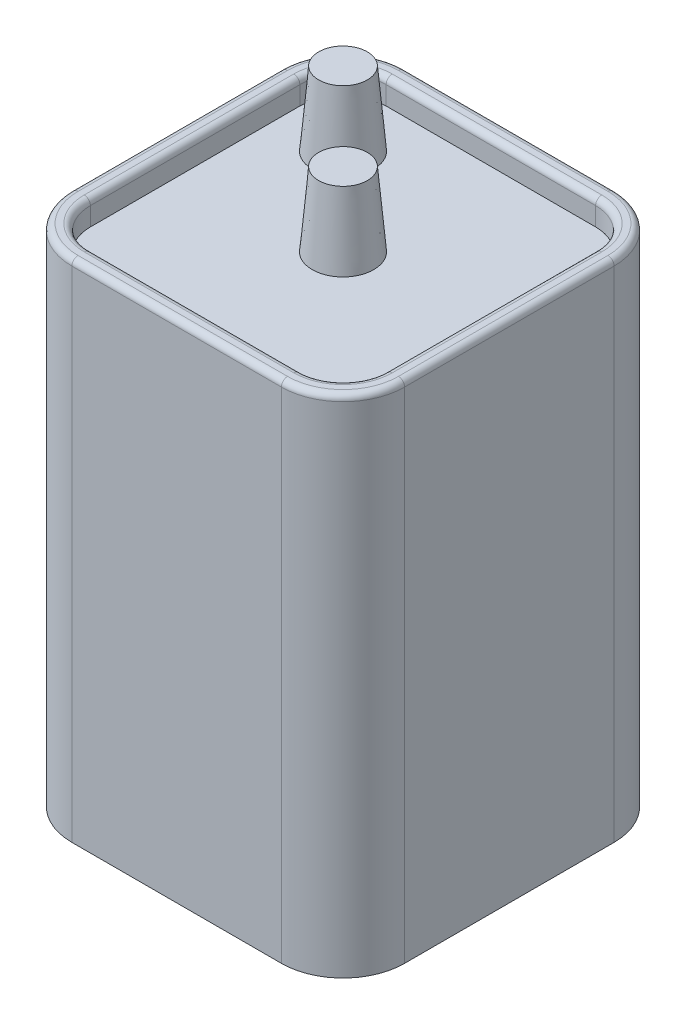
ISO-10303-21;
HEADER;
FILE_DESCRIPTION(('STEP AP214'),'2;1');
FILE_NAME('part.step','',(''),(''),'','','');
FILE_SCHEMA(('AUTOMOTIVE_DESIGN { 1 0 10303 214 1 1 1 1 }'));
ENDSEC;
DATA;
#1=APPLICATION_CONTEXT('core data for automotive mechanical design processes');
#2=APPLICATION_PROTOCOL_DEFINITION('international standard','automotive_design',2000,#1);
#3=PRODUCT_CONTEXT('',#1,'mechanical');
#4=PRODUCT('Part','Part','',(#3));
#5=PRODUCT_RELATED_PRODUCT_CATEGORY('part','',(#4));
#6=PRODUCT_DEFINITION_FORMATION('','',#4);
#7=PRODUCT_DEFINITION_CONTEXT('part definition',#1,'design');
#8=PRODUCT_DEFINITION('design','',#6,#7);
#9=PRODUCT_DEFINITION_SHAPE('','',#8);
#10=(LENGTH_UNIT() NAMED_UNIT(*) SI_UNIT(.MILLI.,.METRE.));
#11=(NAMED_UNIT(*) PLANE_ANGLE_UNIT() SI_UNIT($,.RADIAN.));
#12=(NAMED_UNIT(*) SI_UNIT($,.STERADIAN.) SOLID_ANGLE_UNIT());
#13=UNCERTAINTY_MEASURE_WITH_UNIT(LENGTH_MEASURE(1.E-05),#10,'distance_accuracy_value','');
#14=(GEOMETRIC_REPRESENTATION_CONTEXT(3) GLOBAL_UNCERTAINTY_ASSIGNED_CONTEXT((#13)) GLOBAL_UNIT_ASSIGNED_CONTEXT((#10,
#11,#12)) REPRESENTATION_CONTEXT('',''));
#15=CARTESIAN_POINT('',(0.,0.,0.));
#16=DIRECTION('',(0.,0.,1.));
#17=DIRECTION('',(1.,0.,0.));
#18=AXIS2_PLACEMENT_3D('',#15,#16,#17);
#19=CARTESIAN_POINT('',(34.29,104.14,-34.29));
#20=DIRECTION('',(-1.,0.,0.));
#21=DIRECTION('',(0.,0.,1.));
#22=AXIS2_PLACEMENT_3D('',#19,#20,#21);
#23=PLANE('',#22);
#24=DIRECTION('',(0.,-1.,0.));
#25=VECTOR('',#24,1.);
#26=CARTESIAN_POINT('',(34.29,104.14,-21.59));
#27=LINE('',#26,#25);
#28=CARTESIAN_POINT('',(34.29,0.,-21.59));
#29=VERTEX_POINT('',#28);
#30=CARTESIAN_POINT('',(34.29,102.87,-21.59));
#31=VERTEX_POINT('',#30);
#32=EDGE_CURVE('E301',#29,#31,#27,.F.);
#33=ORIENTED_EDGE('',*,*,#32,.T.);
#34=DIRECTION('',(0.,0.,-1.));
#35=VECTOR('',#34,1.);
#36=CARTESIAN_POINT('',(34.29,102.87,21.59));
#37=LINE('',#36,#35);
#38=CARTESIAN_POINT('',(34.29,102.87,21.59));
#39=VERTEX_POINT('',#38);
#40=EDGE_CURVE('E346',#31,#39,#37,.F.);
#41=ORIENTED_EDGE('',*,*,#40,.T.);
#42=DIRECTION('',(0.,-1.,0.));
#43=VECTOR('',#42,1.);
#44=CARTESIAN_POINT('',(34.29,104.14,21.59));
#45=LINE('',#44,#43);
#46=CARTESIAN_POINT('',(34.29,0.,21.59));
#47=VERTEX_POINT('',#46);
#48=EDGE_CURVE('E299',#39,#47,#45,.T.);
#49=ORIENTED_EDGE('',*,*,#48,.T.);
#50=DIRECTION('',(0.,0.,-1.));
#51=VECTOR('',#50,1.);
#52=CARTESIAN_POINT('',(34.29,0.,-34.29));
#53=LINE('',#52,#51);
#54=EDGE_CURVE('E255',#47,#29,#53,.T.);
#55=ORIENTED_EDGE('',*,*,#54,.T.);
#56=EDGE_LOOP('',(#33,#41,#49,#55));
#57=FACE_BOUND('',#56,.T.);
#58=ADVANCED_FACE('F44',(#57),#23,.F.);
#59=CARTESIAN_POINT('',(-34.29,104.14,-34.29));
#60=DIRECTION('',(0.,0.,1.));
#61=DIRECTION('',(1.,0.,0.));
#62=AXIS2_PLACEMENT_3D('',#59,#60,#61);
#63=PLANE('',#62);
#64=DIRECTION('',(0.,-1.,0.));
#65=VECTOR('',#64,1.);
#66=CARTESIAN_POINT('',(-21.59,104.14,-34.29));
#67=LINE('',#66,#65);
#68=CARTESIAN_POINT('',(-21.59,0.,-34.29));
#69=VERTEX_POINT('',#68);
#70=CARTESIAN_POINT('',(-21.59,102.87,-34.29));
#71=VERTEX_POINT('',#70);
#72=EDGE_CURVE('E296',#69,#71,#67,.F.);
#73=ORIENTED_EDGE('',*,*,#72,.T.);
#74=DIRECTION('',(-1.,0.,0.));
#75=VECTOR('',#74,1.);
#76=CARTESIAN_POINT('',(21.59,102.87,-34.29));
#77=LINE('',#76,#75);
#78=CARTESIAN_POINT('',(21.59,102.87,-34.29));
#79=VERTEX_POINT('',#78);
#80=EDGE_CURVE('E358',#71,#79,#77,.F.);
#81=ORIENTED_EDGE('',*,*,#80,.T.);
#82=DIRECTION('',(0.,-1.,0.));
#83=VECTOR('',#82,1.);
#84=CARTESIAN_POINT('',(21.59,104.14,-34.29));
#85=LINE('',#84,#83);
#86=CARTESIAN_POINT('',(21.59,0.,-34.29));
#87=VERTEX_POINT('',#86);
#88=EDGE_CURVE('E294',#79,#87,#85,.T.);
#89=ORIENTED_EDGE('',*,*,#88,.T.);
#90=DIRECTION('',(-1.,0.,0.));
#91=VECTOR('',#90,1.);
#92=CARTESIAN_POINT('',(-34.29,0.,-34.29));
#93=LINE('',#92,#91);
#94=EDGE_CURVE('E272',#87,#69,#93,.T.);
#95=ORIENTED_EDGE('',*,*,#94,.T.);
#96=EDGE_LOOP('',(#73,#81,#89,#95));
#97=FACE_BOUND('',#96,.T.);
#98=ADVANCED_FACE('F460',(#97),#63,.F.);
#99=CARTESIAN_POINT('',(-34.29,104.14,-34.29));
#100=DIRECTION('',(1.,0.,0.));
#101=DIRECTION('',(0.,0.,-1.));
#102=AXIS2_PLACEMENT_3D('',#99,#100,#101);
#103=PLANE('',#102);
#104=DIRECTION('',(0.,-1.,0.));
#105=VECTOR('',#104,1.);
#106=CARTESIAN_POINT('',(-34.29,104.14,21.59));
#107=LINE('',#106,#105);
#108=CARTESIAN_POINT('',(-34.29,0.,21.59));
#109=VERTEX_POINT('',#108);
#110=CARTESIAN_POINT('',(-34.29,102.87,21.59));
#111=VERTEX_POINT('',#110);
#112=EDGE_CURVE('E281',#109,#111,#107,.F.);
#113=ORIENTED_EDGE('',*,*,#112,.T.);
#114=DIRECTION('',(0.,0.,1.));
#115=VECTOR('',#114,1.);
#116=CARTESIAN_POINT('',(-34.29,102.87,-21.59));
#117=LINE('',#116,#115);
#118=CARTESIAN_POINT('',(-34.29,102.87,-21.59));
#119=VERTEX_POINT('',#118);
#120=EDGE_CURVE('E354',#111,#119,#117,.F.);
#121=ORIENTED_EDGE('',*,*,#120,.T.);
#122=DIRECTION('',(0.,-1.,0.));
#123=VECTOR('',#122,1.);
#124=CARTESIAN_POINT('',(-34.29,104.14,-21.59));
#125=LINE('',#124,#123);
#126=CARTESIAN_POINT('',(-34.29,0.,-21.59));
#127=VERTEX_POINT('',#126);
#128=EDGE_CURVE('E284',#119,#127,#125,.T.);
#129=ORIENTED_EDGE('',*,*,#128,.T.);
#130=DIRECTION('',(0.,0.,1.));
#131=VECTOR('',#130,1.);
#132=CARTESIAN_POINT('',(-34.29,0.,-34.29));
#133=LINE('',#132,#131);
#134=EDGE_CURVE('E275',#127,#109,#133,.T.);
#135=ORIENTED_EDGE('',*,*,#134,.T.);
#136=EDGE_LOOP('',(#113,#121,#129,#135));
#137=FACE_BOUND('',#136,.T.);
#138=ADVANCED_FACE('F466',(#137),#103,.F.);
#139=CARTESIAN_POINT('',(-34.29,104.14,34.29));
#140=DIRECTION('',(0.,0.,-1.));
#141=DIRECTION('',(-1.,0.,0.));
#142=AXIS2_PLACEMENT_3D('',#139,#140,#141);
#143=PLANE('',#142);
#144=DIRECTION('',(0.,-1.,0.));
#145=VECTOR('',#144,1.);
#146=CARTESIAN_POINT('',(21.59,104.14,34.29));
#147=LINE('',#146,#145);
#148=CARTESIAN_POINT('',(21.59,0.,34.29));
#149=VERTEX_POINT('',#148);
#150=CARTESIAN_POINT('',(21.59,102.87,34.29));
#151=VERTEX_POINT('',#150);
#152=EDGE_CURVE('E306',#149,#151,#147,.F.);
#153=ORIENTED_EDGE('',*,*,#152,.T.);
#154=DIRECTION('',(1.,0.,0.));
#155=VECTOR('',#154,1.);
#156=CARTESIAN_POINT('',(-21.59,102.87,34.29));
#157=LINE('',#156,#155);
#158=CARTESIAN_POINT('',(-21.59,102.87,34.29));
#159=VERTEX_POINT('',#158);
#160=EDGE_CURVE('E350',#151,#159,#157,.F.);
#161=ORIENTED_EDGE('',*,*,#160,.T.);
#162=DIRECTION('',(0.,-1.,0.));
#163=VECTOR('',#162,1.);
#164=CARTESIAN_POINT('',(-21.59,104.14,34.29));
#165=LINE('',#164,#163);
#166=CARTESIAN_POINT('',(-21.59,0.,34.29));
#167=VERTEX_POINT('',#166);
#168=EDGE_CURVE('E304',#159,#167,#165,.T.);
#169=ORIENTED_EDGE('',*,*,#168,.T.);
#170=DIRECTION('',(1.,0.,0.));
#171=VECTOR('',#170,1.);
#172=CARTESIAN_POINT('',(-34.29,0.,34.29));
#173=LINE('',#172,#171);
#174=EDGE_CURVE('E278',#167,#149,#173,.T.);
#175=ORIENTED_EDGE('',*,*,#174,.T.);
#176=EDGE_LOOP('',(#153,#161,#169,#175));
#177=FACE_BOUND('',#176,.T.);
#178=ADVANCED_FACE('F665',(#177),#143,.F.);
#179=CARTESIAN_POINT('',(0.,104.14,0.));
#180=DIRECTION('',(0.,1.,0.));
#181=DIRECTION('',(0.,0.,1.));
#182=AXIS2_PLACEMENT_3D('',#179,#180,#181);
#183=PLANE('',#182);
#184=DIRECTION('',(0.,0.,-1.));
#185=VECTOR('',#184,1.);
#186=CARTESIAN_POINT('',(33.02,104.14,-21.59));
#187=LINE('',#186,#185);
#188=CARTESIAN_POINT('',(33.02,104.14,21.59));
#189=VERTEX_POINT('',#188);
#190=CARTESIAN_POINT('',(33.02,104.14,-21.59));
#191=VERTEX_POINT('',#190);
#192=EDGE_CURVE('E338',#189,#191,#187,.T.);
#193=ORIENTED_EDGE('',*,*,#192,.T.);
#194=CARTESIAN_POINT('',(21.59,104.14,-21.59));
#195=DIRECTION('',(0.,1.,0.));
#196=DIRECTION('',(0.,0.,1.));
#197=AXIS2_PLACEMENT_3D('',#194,#195,#196);
#198=CIRCLE('',#197,11.43);
#199=CARTESIAN_POINT('',(21.59,104.14,-33.02));
#200=VERTEX_POINT('',#199);
#201=EDGE_CURVE('E340',#191,#200,#198,.T.);
#202=ORIENTED_EDGE('',*,*,#201,.T.);
#203=DIRECTION('',(-1.,0.,0.));
#204=VECTOR('',#203,1.);
#205=CARTESIAN_POINT('',(-21.59,104.14,-33.02));
#206=LINE('',#205,#204);
#207=CARTESIAN_POINT('',(-21.59,104.14,-33.02));
#208=VERTEX_POINT('',#207);
#209=EDGE_CURVE('E326',#200,#208,#206,.T.);
#210=ORIENTED_EDGE('',*,*,#209,.T.);
#211=CARTESIAN_POINT('',(-21.59,104.14,-21.59));
#212=DIRECTION('',(0.,1.,0.));
#213=DIRECTION('',(0.,0.,1.));
#214=AXIS2_PLACEMENT_3D('',#211,#212,#213);
#215=CIRCLE('',#214,11.43);
#216=CARTESIAN_POINT('',(-33.02,104.14,-21.59));
#217=VERTEX_POINT('',#216);
#218=EDGE_CURVE('E328',#208,#217,#215,.T.);
#219=ORIENTED_EDGE('',*,*,#218,.T.);
#220=DIRECTION('',(0.,0.,1.));
#221=VECTOR('',#220,1.);
#222=CARTESIAN_POINT('',(-33.02,104.14,21.59));
#223=LINE('',#222,#221);
#224=CARTESIAN_POINT('',(-33.02,104.14,21.59));
#225=VERTEX_POINT('',#224);
#226=EDGE_CURVE('E330',#217,#225,#223,.T.);
#227=ORIENTED_EDGE('',*,*,#226,.T.);
#228=CARTESIAN_POINT('',(-21.59,104.14,21.59));
#229=DIRECTION('',(0.,1.,0.));
#230=DIRECTION('',(0.,0.,1.));
#231=AXIS2_PLACEMENT_3D('',#228,#229,#230);
#232=CIRCLE('',#231,11.43);
#233=CARTESIAN_POINT('',(-21.59,104.14,33.02));
#234=VERTEX_POINT('',#233);
#235=EDGE_CURVE('E332',#225,#234,#232,.T.);
#236=ORIENTED_EDGE('',*,*,#235,.T.);
#237=DIRECTION('',(1.,0.,0.));
#238=VECTOR('',#237,1.);
#239=CARTESIAN_POINT('',(21.59,104.14,33.02));
#240=LINE('',#239,#238);
#241=CARTESIAN_POINT('',(21.59,104.14,33.02));
#242=VERTEX_POINT('',#241);
#243=EDGE_CURVE('E334',#234,#242,#240,.T.);
#244=ORIENTED_EDGE('',*,*,#243,.T.);
#245=CARTESIAN_POINT('',(21.59,104.14,21.59));
#246=DIRECTION('',(0.,1.,0.));
#247=DIRECTION('',(0.,0.,1.));
#248=AXIS2_PLACEMENT_3D('',#245,#246,#247);
#249=CIRCLE('',#248,11.43);
#250=EDGE_CURVE('E336',#242,#189,#249,.T.);
#251=ORIENTED_EDGE('',*,*,#250,.T.);
#252=EDGE_LOOP('',(#193,#202,#210,#219,#227,#236,#244,#251));
#253=FACE_BOUND('',#252,.T.);
#254=CARTESIAN_POINT('',(-21.59,104.14,-21.59));
#255=DIRECTION('',(0.,1.,0.));
#256=DIRECTION('',(0.,0.,1.));
#257=AXIS2_PLACEMENT_3D('',#254,#255,#256);
#258=CIRCLE('',#257,10.16);
#259=CARTESIAN_POINT('',(-31.75,104.14,-21.59));
#260=VERTEX_POINT('',#259);
#261=CARTESIAN_POINT('',(-21.59,104.14,-31.75));
#262=VERTEX_POINT('',#261);
#263=EDGE_CURVE('E321',#260,#262,#258,.F.);
#264=ORIENTED_EDGE('',*,*,#263,.T.);
#265=DIRECTION('',(-1.,0.,0.));
#266=VECTOR('',#265,1.);
#267=CARTESIAN_POINT('',(21.59,104.14,-31.75));
#268=LINE('',#267,#266);
#269=CARTESIAN_POINT('',(21.59,104.14,-31.75));
#270=VERTEX_POINT('',#269);
#271=EDGE_CURVE('E323',#262,#270,#268,.F.);
#272=ORIENTED_EDGE('',*,*,#271,.T.);
#273=CARTESIAN_POINT('',(21.59,104.14,-21.59));
#274=DIRECTION('',(0.,1.,0.));
#275=DIRECTION('',(0.,0.,1.));
#276=AXIS2_PLACEMENT_3D('',#273,#274,#275);
#277=CIRCLE('',#276,10.16);
#278=CARTESIAN_POINT('',(31.75,104.14,-21.59));
#279=VERTEX_POINT('',#278);
#280=EDGE_CURVE('E309',#270,#279,#277,.F.);
#281=ORIENTED_EDGE('',*,*,#280,.T.);
#282=DIRECTION('',(0.,0.,-1.));
#283=VECTOR('',#282,1.);
#284=CARTESIAN_POINT('',(31.75,104.14,21.59));
#285=LINE('',#284,#283);
#286=CARTESIAN_POINT('',(31.75,104.14,21.59));
#287=VERTEX_POINT('',#286);
#288=EDGE_CURVE('E311',#279,#287,#285,.F.);
#289=ORIENTED_EDGE('',*,*,#288,.T.);
#290=CARTESIAN_POINT('',(21.59,104.14,21.59));
#291=DIRECTION('',(0.,1.,0.));
#292=DIRECTION('',(0.,0.,1.));
#293=AXIS2_PLACEMENT_3D('',#290,#291,#292);
#294=CIRCLE('',#293,10.16);
#295=CARTESIAN_POINT('',(21.59,104.14,31.75));
#296=VERTEX_POINT('',#295);
#297=EDGE_CURVE('E313',#287,#296,#294,.F.);
#298=ORIENTED_EDGE('',*,*,#297,.T.);
#299=DIRECTION('',(1.,0.,0.));
#300=VECTOR('',#299,1.);
#301=CARTESIAN_POINT('',(-21.59,104.14,31.75));
#302=LINE('',#301,#300);
#303=CARTESIAN_POINT('',(-21.59,104.14,31.75));
#304=VERTEX_POINT('',#303);
#305=EDGE_CURVE('E315',#296,#304,#302,.F.);
#306=ORIENTED_EDGE('',*,*,#305,.T.);
#307=CARTESIAN_POINT('',(-21.59,104.14,21.59));
#308=DIRECTION('',(0.,1.,0.));
#309=DIRECTION('',(0.,0.,1.));
#310=AXIS2_PLACEMENT_3D('',#307,#308,#309);
#311=CIRCLE('',#310,10.16);
#312=CARTESIAN_POINT('',(-31.75,104.14,21.59));
#313=VERTEX_POINT('',#312);
#314=EDGE_CURVE('E317',#304,#313,#311,.F.);
#315=ORIENTED_EDGE('',*,*,#314,.T.);
#316=DIRECTION('',(0.,0.,1.));
#317=VECTOR('',#316,1.);
#318=CARTESIAN_POINT('',(-31.75,104.14,-21.59));
#319=LINE('',#318,#317);
#320=EDGE_CURVE('E319',#313,#260,#319,.F.);
#321=ORIENTED_EDGE('',*,*,#320,.T.);
#322=EDGE_LOOP('',(#264,#272,#281,#289,#298,#306,#315,#321));
#323=FACE_BOUND('',#322,.T.);
#324=ADVANCED_FACE('F421',(#253,#323),#183,.T.);
#325=CARTESIAN_POINT('',(0.,0.,0.));
#326=DIRECTION('',(0.,1.,0.));
#327=DIRECTION('',(0.,0.,1.));
#328=AXIS2_PLACEMENT_3D('',#325,#326,#327);
#329=PLANE('',#328);
#330=ORIENTED_EDGE('',*,*,#134,.F.);
#331=CARTESIAN_POINT('',(-21.59,0.,-21.59));
#332=DIRECTION('',(0.,1.,0.));
#333=DIRECTION('',(0.,0.,1.));
#334=AXIS2_PLACEMENT_3D('',#331,#332,#333);
#335=CIRCLE('',#334,12.7);
#336=EDGE_CURVE('E292',#127,#69,#335,.F.);
#337=ORIENTED_EDGE('',*,*,#336,.T.);
#338=ORIENTED_EDGE('',*,*,#94,.F.);
#339=CARTESIAN_POINT('',(21.59,0.,-21.59));
#340=DIRECTION('',(0.,1.,0.));
#341=DIRECTION('',(0.,0.,1.));
#342=AXIS2_PLACEMENT_3D('',#339,#340,#341);
#343=CIRCLE('',#342,12.7);
#344=EDGE_CURVE('E290',#87,#29,#343,.F.);
#345=ORIENTED_EDGE('',*,*,#344,.T.);
#346=ORIENTED_EDGE('',*,*,#54,.F.);
#347=CARTESIAN_POINT('',(21.59,0.,21.59));
#348=DIRECTION('',(0.,1.,0.));
#349=DIRECTION('',(0.,0.,1.));
#350=AXIS2_PLACEMENT_3D('',#347,#348,#349);
#351=CIRCLE('',#350,12.7);
#352=EDGE_CURVE('E288',#47,#149,#351,.F.);
#353=ORIENTED_EDGE('',*,*,#352,.T.);
#354=ORIENTED_EDGE('',*,*,#174,.F.);
#355=CARTESIAN_POINT('',(-21.59,0.,21.59));
#356=DIRECTION('',(0.,1.,0.));
#357=DIRECTION('',(0.,0.,1.));
#358=AXIS2_PLACEMENT_3D('',#355,#356,#357);
#359=CIRCLE('',#358,12.7);
#360=EDGE_CURVE('E286',#167,#109,#359,.F.);
#361=ORIENTED_EDGE('',*,*,#360,.T.);
#362=EDGE_LOOP('',(#330,#337,#338,#345,#346,#353,#354,#361));
#363=FACE_BOUND('',#362,.T.);
#364=ADVANCED_FACE('F475',(#363),#329,.F.);
#365=CARTESIAN_POINT('',(-21.59,104.14,-21.59));
#366=DIRECTION('',(0.,-1.,0.));
#367=DIRECTION('',(0.,0.,-1.));
#368=AXIS2_PLACEMENT_3D('',#365,#366,#367);
#369=CYLINDRICAL_SURFACE('',#368,12.7);
#370=ORIENTED_EDGE('',*,*,#128,.F.);
#371=CARTESIAN_POINT('',(-21.59,102.87,-21.59));
#372=DIRECTION('',(0.,1.,0.));
#373=DIRECTION('',(0.,0.,1.));
#374=AXIS2_PLACEMENT_3D('',#371,#372,#373);
#375=CIRCLE('',#374,12.7);
#376=EDGE_CURVE('E356',#119,#71,#375,.F.);
#377=ORIENTED_EDGE('',*,*,#376,.T.);
#378=ORIENTED_EDGE('',*,*,#72,.F.);
#379=ORIENTED_EDGE('',*,*,#336,.F.);
#380=EDGE_LOOP('',(#370,#377,#378,#379));
#381=FACE_BOUND('',#380,.T.);
#382=ADVANCED_FACE('F471',(#381),#369,.T.);
#383=CARTESIAN_POINT('',(21.59,104.14,-21.59));
#384=DIRECTION('',(0.,-1.,0.));
#385=DIRECTION('',(0.,0.,-1.));
#386=AXIS2_PLACEMENT_3D('',#383,#384,#385);
#387=CYLINDRICAL_SURFACE('',#386,12.7);
#388=ORIENTED_EDGE('',*,*,#88,.F.);
#389=CARTESIAN_POINT('',(21.59,102.87,-21.59));
#390=DIRECTION('',(0.,1.,0.));
#391=DIRECTION('',(0.,0.,1.));
#392=AXIS2_PLACEMENT_3D('',#389,#390,#391);
#393=CIRCLE('',#392,12.7);
#394=EDGE_CURVE('E343',#79,#31,#393,.F.);
#395=ORIENTED_EDGE('',*,*,#394,.T.);
#396=ORIENTED_EDGE('',*,*,#32,.F.);
#397=ORIENTED_EDGE('',*,*,#344,.F.);
#398=EDGE_LOOP('',(#388,#395,#396,#397));
#399=FACE_BOUND('',#398,.T.);
#400=ADVANCED_FACE('F474',(#399),#387,.T.);
#401=CARTESIAN_POINT('',(21.59,104.14,21.59));
#402=DIRECTION('',(0.,-1.,0.));
#403=DIRECTION('',(0.,0.,-1.));
#404=AXIS2_PLACEMENT_3D('',#401,#402,#403);
#405=CYLINDRICAL_SURFACE('',#404,12.7);
#406=ORIENTED_EDGE('',*,*,#48,.F.);
#407=CARTESIAN_POINT('',(21.59,102.87,21.59));
#408=DIRECTION('',(0.,1.,0.));
#409=DIRECTION('',(0.,0.,1.));
#410=AXIS2_PLACEMENT_3D('',#407,#408,#409);
#411=CIRCLE('',#410,12.7);
#412=EDGE_CURVE('E348',#39,#151,#411,.F.);
#413=ORIENTED_EDGE('',*,*,#412,.T.);
#414=ORIENTED_EDGE('',*,*,#152,.F.);
#415=ORIENTED_EDGE('',*,*,#352,.F.);
#416=EDGE_LOOP('',(#406,#413,#414,#415));
#417=FACE_BOUND('',#416,.T.);
#418=ADVANCED_FACE('F479',(#417),#405,.T.);
#419=CARTESIAN_POINT('',(-21.59,104.14,21.59));
#420=DIRECTION('',(0.,-1.,0.));
#421=DIRECTION('',(0.,0.,-1.));
#422=AXIS2_PLACEMENT_3D('',#419,#420,#421);
#423=CYLINDRICAL_SURFACE('',#422,12.7);
#424=ORIENTED_EDGE('',*,*,#168,.F.);
#425=CARTESIAN_POINT('',(-21.59,102.87,21.59));
#426=DIRECTION('',(0.,1.,0.));
#427=DIRECTION('',(0.,0.,1.));
#428=AXIS2_PLACEMENT_3D('',#425,#426,#427);
#429=CIRCLE('',#428,12.7);
#430=EDGE_CURVE('E352',#159,#111,#429,.F.);
#431=ORIENTED_EDGE('',*,*,#430,.T.);
#432=ORIENTED_EDGE('',*,*,#112,.F.);
#433=ORIENTED_EDGE('',*,*,#360,.F.);
#434=EDGE_LOOP('',(#424,#431,#432,#433));
#435=FACE_BOUND('',#434,.T.);
#436=ADVANCED_FACE('F483',(#435),#423,.T.);
#437=CARTESIAN_POINT('',(21.59,99.06,-21.59));
#438=DIRECTION('',(0.,1.,0.));
#439=DIRECTION('',(0.,0.,1.));
#440=AXIS2_PLACEMENT_3D('',#437,#438,#439);
#441=CYLINDRICAL_SURFACE('',#440,8.89);
#442=DIRECTION('',(0.,1.,0.));
#443=VECTOR('',#442,1.);
#444=CARTESIAN_POINT('',(30.48,99.06,-21.59));
#445=LINE('',#444,#443);
#446=CARTESIAN_POINT('',(30.48,99.06,-21.59));
#447=VERTEX_POINT('',#446);
#448=CARTESIAN_POINT('',(30.48,102.87,-21.59));
#449=VERTEX_POINT('',#448);
#450=EDGE_CURVE('E253',#447,#449,#445,.T.);
#451=ORIENTED_EDGE('',*,*,#450,.T.);
#452=CARTESIAN_POINT('',(21.59,102.87,-21.59));
#453=DIRECTION('',(0.,1.,0.));
#454=DIRECTION('',(0.,0.,1.));
#455=AXIS2_PLACEMENT_3D('',#452,#453,#454);
#456=CIRCLE('',#455,8.89);
#457=CARTESIAN_POINT('',(21.59,102.87,-30.48));
#458=VERTEX_POINT('',#457);
#459=EDGE_CURVE('E13',#449,#458,#456,.T.);
#460=ORIENTED_EDGE('',*,*,#459,.T.);
#461=DIRECTION('',(0.,1.,0.));
#462=VECTOR('',#461,1.);
#463=CARTESIAN_POINT('',(21.59,99.06,-30.48));
#464=LINE('',#463,#462);
#465=CARTESIAN_POINT('',(21.59,99.06,-30.48));
#466=VERTEX_POINT('',#465);
#467=EDGE_CURVE('E206',#466,#458,#464,.T.);
#468=ORIENTED_EDGE('',*,*,#467,.F.);
#469=CARTESIAN_POINT('',(21.59,99.06,-21.59));
#470=DIRECTION('',(0.,1.,0.));
#471=DIRECTION('',(0.,0.,1.));
#472=AXIS2_PLACEMENT_3D('',#469,#470,#471);
#473=CIRCLE('',#472,8.89);
#474=EDGE_CURVE('E210',#447,#466,#473,.T.);
#475=ORIENTED_EDGE('',*,*,#474,.F.);
#476=EDGE_LOOP('',(#451,#460,#468,#475));
#477=FACE_BOUND('',#476,.T.);
#478=ADVANCED_FACE('F208',(#477),#441,.F.);
#479=CARTESIAN_POINT('',(30.48,99.06,21.59));
#480=DIRECTION('',(1.,0.,0.));
#481=DIRECTION('',(0.,0.,-1.));
#482=AXIS2_PLACEMENT_3D('',#479,#480,#481);
#483=PLANE('',#482);
#484=DIRECTION('',(0.,1.,0.));
#485=VECTOR('',#484,1.);
#486=CARTESIAN_POINT('',(30.48,99.06,21.59));
#487=LINE('',#486,#485);
#488=CARTESIAN_POINT('',(30.48,99.06,21.59));
#489=VERTEX_POINT('',#488);
#490=CARTESIAN_POINT('',(30.48,102.87,21.59));
#491=VERTEX_POINT('',#490);
#492=EDGE_CURVE('E256',#489,#491,#487,.T.);
#493=ORIENTED_EDGE('',*,*,#492,.T.);
#494=DIRECTION('',(0.,0.,-1.));
#495=VECTOR('',#494,1.);
#496=CARTESIAN_POINT('',(30.48,102.87,-21.59));
#497=LINE('',#496,#495);
#498=EDGE_CURVE('E53',#491,#449,#497,.T.);
#499=ORIENTED_EDGE('',*,*,#498,.T.);
#500=ORIENTED_EDGE('',*,*,#450,.F.);
#501=DIRECTION('',(0.,0.,-1.));
#502=VECTOR('',#501,1.);
#503=CARTESIAN_POINT('',(30.48,99.06,21.59));
#504=LINE('',#503,#502);
#505=EDGE_CURVE('E217',#489,#447,#504,.T.);
#506=ORIENTED_EDGE('',*,*,#505,.F.);
#507=EDGE_LOOP('',(#493,#499,#500,#506));
#508=FACE_BOUND('',#507,.T.);
#509=ADVANCED_FACE('F449',(#508),#483,.F.);
#510=CARTESIAN_POINT('',(21.59,99.06,21.59));
#511=DIRECTION('',(0.,1.,0.));
#512=DIRECTION('',(0.,0.,1.));
#513=AXIS2_PLACEMENT_3D('',#510,#511,#512);
#514=CYLINDRICAL_SURFACE('',#513,8.89);
#515=DIRECTION('',(0.,1.,0.));
#516=VECTOR('',#515,1.);
#517=CARTESIAN_POINT('',(21.59,99.06,30.48));
#518=LINE('',#517,#516);
#519=CARTESIAN_POINT('',(21.59,99.06,30.48));
#520=VERTEX_POINT('',#519);
#521=CARTESIAN_POINT('',(21.59,102.87,30.48));
#522=VERTEX_POINT('',#521);
#523=EDGE_CURVE('E258',#520,#522,#518,.T.);
#524=ORIENTED_EDGE('',*,*,#523,.T.);
#525=CARTESIAN_POINT('',(21.59,102.87,21.59));
#526=DIRECTION('',(0.,1.,0.));
#527=DIRECTION('',(0.,0.,1.));
#528=AXIS2_PLACEMENT_3D('',#525,#526,#527);
#529=CIRCLE('',#528,8.89);
#530=EDGE_CURVE('E68',#522,#491,#529,.T.);
#531=ORIENTED_EDGE('',*,*,#530,.T.);
#532=ORIENTED_EDGE('',*,*,#492,.F.);
#533=CARTESIAN_POINT('',(21.59,99.06,21.59));
#534=DIRECTION('',(0.,1.,0.));
#535=DIRECTION('',(0.,0.,1.));
#536=AXIS2_PLACEMENT_3D('',#533,#534,#535);
#537=CIRCLE('',#536,8.89);
#538=EDGE_CURVE('E250',#520,#489,#537,.T.);
#539=ORIENTED_EDGE('',*,*,#538,.F.);
#540=EDGE_LOOP('',(#524,#531,#532,#539));
#541=FACE_BOUND('',#540,.T.);
#542=ADVANCED_FACE('F450',(#541),#514,.F.);
#543=CARTESIAN_POINT('',(-21.59,99.06,30.48));
#544=DIRECTION('',(0.,0.,1.));
#545=DIRECTION('',(1.,0.,0.));
#546=AXIS2_PLACEMENT_3D('',#543,#544,#545);
#547=PLANE('',#546);
#548=DIRECTION('',(0.,1.,0.));
#549=VECTOR('',#548,1.);
#550=CARTESIAN_POINT('',(-21.59,99.06,30.48));
#551=LINE('',#550,#549);
#552=CARTESIAN_POINT('',(-21.59,99.06,30.48));
#553=VERTEX_POINT('',#552);
#554=CARTESIAN_POINT('',(-21.59,102.87,30.48));
#555=VERTEX_POINT('',#554);
#556=EDGE_CURVE('E260',#553,#555,#551,.T.);
#557=ORIENTED_EDGE('',*,*,#556,.T.);
#558=DIRECTION('',(1.,0.,0.));
#559=VECTOR('',#558,1.);
#560=CARTESIAN_POINT('',(21.59,102.87,30.48));
#561=LINE('',#560,#559);
#562=EDGE_CURVE('E368',#555,#522,#561,.T.);
#563=ORIENTED_EDGE('',*,*,#562,.T.);
#564=ORIENTED_EDGE('',*,*,#523,.F.);
#565=DIRECTION('',(1.,0.,0.));
#566=VECTOR('',#565,1.);
#567=CARTESIAN_POINT('',(-21.59,99.06,30.48));
#568=LINE('',#567,#566);
#569=EDGE_CURVE('E247',#553,#520,#568,.T.);
#570=ORIENTED_EDGE('',*,*,#569,.F.);
#571=EDGE_LOOP('',(#557,#563,#564,#570));
#572=FACE_BOUND('',#571,.T.);
#573=ADVANCED_FACE('F447',(#572),#547,.F.);
#574=CARTESIAN_POINT('',(-21.59,99.06,21.59));
#575=DIRECTION('',(0.,1.,0.));
#576=DIRECTION('',(0.,0.,1.));
#577=AXIS2_PLACEMENT_3D('',#574,#575,#576);
#578=CYLINDRICAL_SURFACE('',#577,8.89);
#579=DIRECTION('',(0.,1.,0.));
#580=VECTOR('',#579,1.);
#581=CARTESIAN_POINT('',(-30.48,99.06,21.59));
#582=LINE('',#581,#580);
#583=CARTESIAN_POINT('',(-30.48,99.06,21.59));
#584=VERTEX_POINT('',#583);
#585=CARTESIAN_POINT('',(-30.48,102.87,21.59));
#586=VERTEX_POINT('',#585);
#587=EDGE_CURVE('E263',#584,#586,#582,.T.);
#588=ORIENTED_EDGE('',*,*,#587,.T.);
#589=CARTESIAN_POINT('',(-21.59,102.87,21.59));
#590=DIRECTION('',(0.,1.,0.));
#591=DIRECTION('',(0.,0.,1.));
#592=AXIS2_PLACEMENT_3D('',#589,#590,#591);
#593=CIRCLE('',#592,8.89);
#594=EDGE_CURVE('E366',#586,#555,#593,.T.);
#595=ORIENTED_EDGE('',*,*,#594,.T.);
#596=ORIENTED_EDGE('',*,*,#556,.F.);
#597=CARTESIAN_POINT('',(-21.59,99.06,21.59));
#598=DIRECTION('',(0.,1.,0.));
#599=DIRECTION('',(0.,0.,1.));
#600=AXIS2_PLACEMENT_3D('',#597,#598,#599);
#601=CIRCLE('',#600,8.89);
#602=EDGE_CURVE('E244',#584,#553,#601,.T.);
#603=ORIENTED_EDGE('',*,*,#602,.F.);
#604=EDGE_LOOP('',(#588,#595,#596,#603));
#605=FACE_BOUND('',#604,.T.);
#606=ADVANCED_FACE('F444',(#605),#578,.F.);
#607=CARTESIAN_POINT('',(-30.48,99.06,-21.59));
#608=DIRECTION('',(-1.,0.,0.));
#609=DIRECTION('',(0.,0.,1.));
#610=AXIS2_PLACEMENT_3D('',#607,#608,#609);
#611=PLANE('',#610);
#612=DIRECTION('',(0.,1.,0.));
#613=VECTOR('',#612,1.);
#614=CARTESIAN_POINT('',(-30.48,99.06,-21.59));
#615=LINE('',#614,#613);
#616=CARTESIAN_POINT('',(-30.48,99.06,-21.59));
#617=VERTEX_POINT('',#616);
#618=CARTESIAN_POINT('',(-30.48,102.87,-21.59));
#619=VERTEX_POINT('',#618);
#620=EDGE_CURVE('E266',#617,#619,#615,.T.);
#621=ORIENTED_EDGE('',*,*,#620,.T.);
#622=DIRECTION('',(0.,0.,1.));
#623=VECTOR('',#622,1.);
#624=CARTESIAN_POINT('',(-30.48,102.87,21.59));
#625=LINE('',#624,#623);
#626=EDGE_CURVE('E364',#619,#586,#625,.T.);
#627=ORIENTED_EDGE('',*,*,#626,.T.);
#628=ORIENTED_EDGE('',*,*,#587,.F.);
#629=DIRECTION('',(0.,0.,1.));
#630=VECTOR('',#629,1.);
#631=CARTESIAN_POINT('',(-30.48,99.06,-21.59));
#632=LINE('',#631,#630);
#633=EDGE_CURVE('E241',#617,#584,#632,.T.);
#634=ORIENTED_EDGE('',*,*,#633,.F.);
#635=EDGE_LOOP('',(#621,#627,#628,#634));
#636=FACE_BOUND('',#635,.T.);
#637=ADVANCED_FACE('F441',(#636),#611,.F.);
#638=CARTESIAN_POINT('',(-21.59,99.06,-21.59));
#639=DIRECTION('',(0.,1.,0.));
#640=DIRECTION('',(0.,0.,1.));
#641=AXIS2_PLACEMENT_3D('',#638,#639,#640);
#642=CYLINDRICAL_SURFACE('',#641,8.89);
#643=DIRECTION('',(0.,1.,0.));
#644=VECTOR('',#643,1.);
#645=CARTESIAN_POINT('',(-21.59,99.06,-30.48));
#646=LINE('',#645,#644);
#647=CARTESIAN_POINT('',(-21.59,99.06,-30.48));
#648=VERTEX_POINT('',#647);
#649=CARTESIAN_POINT('',(-21.59,102.87,-30.48));
#650=VERTEX_POINT('',#649);
#651=EDGE_CURVE('E216',#648,#650,#646,.T.);
#652=ORIENTED_EDGE('',*,*,#651,.T.);
#653=CARTESIAN_POINT('',(-21.59,102.87,-21.59));
#654=DIRECTION('',(0.,1.,0.));
#655=DIRECTION('',(0.,0.,1.));
#656=AXIS2_PLACEMENT_3D('',#653,#654,#655);
#657=CIRCLE('',#656,8.89);
#658=EDGE_CURVE('E362',#650,#619,#657,.T.);
#659=ORIENTED_EDGE('',*,*,#658,.T.);
#660=ORIENTED_EDGE('',*,*,#620,.F.);
#661=CARTESIAN_POINT('',(-21.59,99.06,-21.59));
#662=DIRECTION('',(0.,1.,0.));
#663=DIRECTION('',(0.,0.,1.));
#664=AXIS2_PLACEMENT_3D('',#661,#662,#663);
#665=CIRCLE('',#664,8.89);
#666=EDGE_CURVE('E226',#648,#617,#665,.T.);
#667=ORIENTED_EDGE('',*,*,#666,.F.);
#668=EDGE_LOOP('',(#652,#659,#660,#667));
#669=FACE_BOUND('',#668,.T.);
#670=ADVANCED_FACE('F437',(#669),#642,.F.);
#671=CARTESIAN_POINT('',(21.59,99.06,-30.48));
#672=DIRECTION('',(0.,0.,-1.));
#673=DIRECTION('',(-1.,0.,0.));
#674=AXIS2_PLACEMENT_3D('',#671,#672,#673);
#675=PLANE('',#674);
#676=ORIENTED_EDGE('',*,*,#467,.T.);
#677=DIRECTION('',(-1.,0.,0.));
#678=VECTOR('',#677,1.);
#679=CARTESIAN_POINT('',(-21.59,102.87,-30.48));
#680=LINE('',#679,#678);
#681=EDGE_CURVE('E360',#458,#650,#680,.T.);
#682=ORIENTED_EDGE('',*,*,#681,.T.);
#683=ORIENTED_EDGE('',*,*,#651,.F.);
#684=DIRECTION('',(-1.,0.,0.));
#685=VECTOR('',#684,1.);
#686=CARTESIAN_POINT('',(21.59,99.06,-30.48));
#687=LINE('',#686,#685);
#688=EDGE_CURVE('E220',#466,#648,#687,.T.);
#689=ORIENTED_EDGE('',*,*,#688,.F.);
#690=EDGE_LOOP('',(#676,#682,#683,#689));
#691=FACE_BOUND('',#690,.T.);
#692=ADVANCED_FACE('F221',(#691),#675,.F.);
#693=CARTESIAN_POINT('',(21.59,99.06,-21.59));
#694=DIRECTION('',(0.,1.,0.));
#695=DIRECTION('',(0.,0.,1.));
#696=AXIS2_PLACEMENT_3D('',#693,#694,#695);
#697=PLANE('',#696);
#698=CARTESIAN_POINT('',(-17.9605122421382,99.06,-17.9605122421384));
#699=DIRECTION('',(0.,1.,0.));
#700=DIRECTION('',(0.,0.,1.));
#701=AXIS2_PLACEMENT_3D('',#698,#699,#700);
#702=CIRCLE('',#701,6.35);
#703=CARTESIAN_POINT('',(-17.9605122421382,99.06,-11.6105122421384));
#704=VERTEX_POINT('',#703);
#705=EDGE_CURVE('E853',#704,#704,#702,.T.);
#706=ORIENTED_EDGE('',*,*,#705,.F.);
#707=EDGE_LOOP('',(#706));
#708=FACE_BOUND('',#707,.T.);
#709=CARTESIAN_POINT('',(0.,99.06,0.));
#710=DIRECTION('',(0.,1.,0.));
#711=DIRECTION('',(0.,0.,1.));
#712=AXIS2_PLACEMENT_3D('',#709,#710,#711);
#713=CIRCLE('',#712,6.35);
#714=CARTESIAN_POINT('',(0.,99.06,6.35));
#715=VERTEX_POINT('',#714);
#716=EDGE_CURVE('E852',#715,#715,#713,.T.);
#717=ORIENTED_EDGE('',*,*,#716,.F.);
#718=EDGE_LOOP('',(#717));
#719=FACE_BOUND('',#718,.T.);
#720=ORIENTED_EDGE('',*,*,#474,.T.);
#721=ORIENTED_EDGE('',*,*,#688,.T.);
#722=ORIENTED_EDGE('',*,*,#666,.T.);
#723=ORIENTED_EDGE('',*,*,#633,.T.);
#724=ORIENTED_EDGE('',*,*,#602,.T.);
#725=ORIENTED_EDGE('',*,*,#569,.T.);
#726=ORIENTED_EDGE('',*,*,#538,.T.);
#727=ORIENTED_EDGE('',*,*,#505,.T.);
#728=EDGE_LOOP('',(#720,#721,#722,#723,#724,#725,#726,#727));
#729=FACE_BOUND('',#728,.T.);
#730=ADVANCED_FACE('F228',(#708,#719,#729),#697,.T.);
#731=CARTESIAN_POINT('',(-21.59,102.87,21.59));
#732=DIRECTION('',(0.,1.,0.));
#733=DIRECTION('',(0.,0.,1.));
#734=AXIS2_PLACEMENT_3D('',#731,#732,#733);
#735=TOROIDAL_SURFACE('',#734,11.43,1.27);
#736=CARTESIAN_POINT('',(-33.02,102.87,21.59));
#737=DIRECTION('',(0.,0.,-1.));
#738=DIRECTION('',(-1.,0.,0.));
#739=AXIS2_PLACEMENT_3D('',#736,#737,#738);
#740=CIRCLE('',#739,1.27);
#741=EDGE_CURVE('E234',#111,#225,#740,.T.);
#742=ORIENTED_EDGE('',*,*,#741,.F.);
#743=ORIENTED_EDGE('',*,*,#430,.F.);
#744=CARTESIAN_POINT('',(-21.59,102.87,33.02));
#745=DIRECTION('',(1.,0.,0.));
#746=DIRECTION('',(0.,0.,-1.));
#747=AXIS2_PLACEMENT_3D('',#744,#745,#746);
#748=CIRCLE('',#747,1.27);
#749=EDGE_CURVE('E231',#234,#159,#748,.T.);
#750=ORIENTED_EDGE('',*,*,#749,.F.);
#751=ORIENTED_EDGE('',*,*,#235,.F.);
#752=EDGE_LOOP('',(#742,#743,#750,#751));
#753=FACE_BOUND('',#752,.T.);
#754=ADVANCED_FACE('F515',(#753),#735,.T.);
#755=CARTESIAN_POINT('',(0.,102.87,33.02));
#756=DIRECTION('',(-1.,0.,0.));
#757=DIRECTION('',(0.,0.,1.));
#758=AXIS2_PLACEMENT_3D('',#755,#756,#757);
#759=CYLINDRICAL_SURFACE('',#758,1.27);
#760=ORIENTED_EDGE('',*,*,#749,.T.);
#761=ORIENTED_EDGE('',*,*,#160,.F.);
#762=CARTESIAN_POINT('',(21.59,102.87,33.02));
#763=DIRECTION('',(1.,0.,0.));
#764=DIRECTION('',(0.,0.,-1.));
#765=AXIS2_PLACEMENT_3D('',#762,#763,#764);
#766=CIRCLE('',#765,1.27);
#767=EDGE_CURVE('E385',#242,#151,#766,.T.);
#768=ORIENTED_EDGE('',*,*,#767,.F.);
#769=ORIENTED_EDGE('',*,*,#243,.F.);
#770=EDGE_LOOP('',(#760,#761,#768,#769));
#771=FACE_BOUND('',#770,.T.);
#772=ADVANCED_FACE('F511',(#771),#759,.T.);
#773=CARTESIAN_POINT('',(-33.02,102.87,0.));
#774=DIRECTION('',(0.,0.,-1.));
#775=DIRECTION('',(-1.,0.,0.));
#776=AXIS2_PLACEMENT_3D('',#773,#774,#775);
#777=CYLINDRICAL_SURFACE('',#776,1.27);
#778=ORIENTED_EDGE('',*,*,#741,.T.);
#779=ORIENTED_EDGE('',*,*,#226,.F.);
#780=CARTESIAN_POINT('',(-33.02,102.87,-21.59));
#781=DIRECTION('',(0.,0.,-1.));
#782=DIRECTION('',(-1.,0.,0.));
#783=AXIS2_PLACEMENT_3D('',#780,#781,#782);
#784=CIRCLE('',#783,1.27);
#785=EDGE_CURVE('E382',#119,#217,#784,.T.);
#786=ORIENTED_EDGE('',*,*,#785,.F.);
#787=ORIENTED_EDGE('',*,*,#120,.F.);
#788=EDGE_LOOP('',(#778,#779,#786,#787));
#789=FACE_BOUND('',#788,.T.);
#790=ADVANCED_FACE('F507',(#789),#777,.T.);
#791=CARTESIAN_POINT('',(21.59,102.87,21.59));
#792=DIRECTION('',(0.,1.,0.));
#793=DIRECTION('',(0.,0.,1.));
#794=AXIS2_PLACEMENT_3D('',#791,#792,#793);
#795=TOROIDAL_SURFACE('',#794,11.43,1.27);
#796=ORIENTED_EDGE('',*,*,#767,.T.);
#797=ORIENTED_EDGE('',*,*,#412,.F.);
#798=CARTESIAN_POINT('',(33.02,102.87,21.59));
#799=DIRECTION('',(0.,0.,-1.));
#800=DIRECTION('',(-1.,0.,0.));
#801=AXIS2_PLACEMENT_3D('',#798,#799,#800);
#802=CIRCLE('',#801,1.27);
#803=EDGE_CURVE('E379',#189,#39,#802,.T.);
#804=ORIENTED_EDGE('',*,*,#803,.F.);
#805=ORIENTED_EDGE('',*,*,#250,.F.);
#806=EDGE_LOOP('',(#796,#797,#804,#805));
#807=FACE_BOUND('',#806,.T.);
#808=ADVANCED_FACE('F503',(#807),#795,.T.);
#809=CARTESIAN_POINT('',(-21.59,102.87,-21.59));
#810=DIRECTION('',(0.,1.,0.));
#811=DIRECTION('',(0.,0.,1.));
#812=AXIS2_PLACEMENT_3D('',#809,#810,#811);
#813=TOROIDAL_SURFACE('',#812,11.43,1.27);
#814=ORIENTED_EDGE('',*,*,#785,.T.);
#815=ORIENTED_EDGE('',*,*,#218,.F.);
#816=CARTESIAN_POINT('',(-21.59,102.87,-33.02));
#817=DIRECTION('',(1.,0.,0.));
#818=DIRECTION('',(0.,0.,-1.));
#819=AXIS2_PLACEMENT_3D('',#816,#817,#818);
#820=CIRCLE('',#819,1.27);
#821=EDGE_CURVE('E376',#71,#208,#820,.T.);
#822=ORIENTED_EDGE('',*,*,#821,.F.);
#823=ORIENTED_EDGE('',*,*,#376,.F.);
#824=EDGE_LOOP('',(#814,#815,#822,#823));
#825=FACE_BOUND('',#824,.T.);
#826=ADVANCED_FACE('F499',(#825),#813,.T.);
#827=CARTESIAN_POINT('',(33.02,102.87,0.));
#828=DIRECTION('',(0.,0.,1.));
#829=DIRECTION('',(1.,0.,0.));
#830=AXIS2_PLACEMENT_3D('',#827,#828,#829);
#831=CYLINDRICAL_SURFACE('',#830,1.27);
#832=ORIENTED_EDGE('',*,*,#803,.T.);
#833=ORIENTED_EDGE('',*,*,#40,.F.);
#834=CARTESIAN_POINT('',(33.02,102.87,-21.59));
#835=DIRECTION('',(0.,0.,-1.));
#836=DIRECTION('',(-1.,0.,0.));
#837=AXIS2_PLACEMENT_3D('',#834,#835,#836);
#838=CIRCLE('',#837,1.27);
#839=EDGE_CURVE('E374',#191,#31,#838,.T.);
#840=ORIENTED_EDGE('',*,*,#839,.F.);
#841=ORIENTED_EDGE('',*,*,#192,.F.);
#842=EDGE_LOOP('',(#832,#833,#840,#841));
#843=FACE_BOUND('',#842,.T.);
#844=ADVANCED_FACE('F495',(#843),#831,.T.);
#845=CARTESIAN_POINT('',(0.,102.87,-33.02));
#846=DIRECTION('',(1.,0.,0.));
#847=DIRECTION('',(0.,0.,-1.));
#848=AXIS2_PLACEMENT_3D('',#845,#846,#847);
#849=CYLINDRICAL_SURFACE('',#848,1.27);
#850=ORIENTED_EDGE('',*,*,#821,.T.);
#851=ORIENTED_EDGE('',*,*,#209,.F.);
#852=CARTESIAN_POINT('',(21.59,102.87,-33.02));
#853=DIRECTION('',(1.,0.,0.));
#854=DIRECTION('',(0.,0.,-1.));
#855=AXIS2_PLACEMENT_3D('',#852,#853,#854);
#856=CIRCLE('',#855,1.27);
#857=EDGE_CURVE('E372',#79,#200,#856,.T.);
#858=ORIENTED_EDGE('',*,*,#857,.F.);
#859=ORIENTED_EDGE('',*,*,#80,.F.);
#860=EDGE_LOOP('',(#850,#851,#858,#859));
#861=FACE_BOUND('',#860,.T.);
#862=ADVANCED_FACE('F491',(#861),#849,.T.);
#863=CARTESIAN_POINT('',(21.59,102.87,-21.59));
#864=DIRECTION('',(0.,1.,0.));
#865=DIRECTION('',(0.,0.,1.));
#866=AXIS2_PLACEMENT_3D('',#863,#864,#865);
#867=TOROIDAL_SURFACE('',#866,11.43,1.27);
#868=ORIENTED_EDGE('',*,*,#839,.T.);
#869=ORIENTED_EDGE('',*,*,#394,.F.);
#870=ORIENTED_EDGE('',*,*,#857,.T.);
#871=ORIENTED_EDGE('',*,*,#201,.F.);
#872=EDGE_LOOP('',(#868,#869,#870,#871));
#873=FACE_BOUND('',#872,.T.);
#874=ADVANCED_FACE('F488',(#873),#867,.T.);
#875=CARTESIAN_POINT('',(-21.59,102.87,31.75));
#876=DIRECTION('',(-1.,0.,0.));
#877=DIRECTION('',(0.,0.,1.));
#878=AXIS2_PLACEMENT_3D('',#875,#876,#877);
#879=CYLINDRICAL_SURFACE('',#878,1.27);
#880=CARTESIAN_POINT('',(-21.59,102.87,31.75));
#881=DIRECTION('',(-1.,0.,0.));
#882=DIRECTION('',(0.,0.,1.));
#883=AXIS2_PLACEMENT_3D('',#880,#881,#882);
#884=CIRCLE('',#883,1.27);
#885=EDGE_CURVE('E405',#304,#555,#884,.T.);
#886=ORIENTED_EDGE('',*,*,#885,.F.);
#887=ORIENTED_EDGE('',*,*,#305,.F.);
#888=CARTESIAN_POINT('',(21.59,102.87,31.75));
#889=DIRECTION('',(1.,0.,0.));
#890=DIRECTION('',(0.,0.,-1.));
#891=AXIS2_PLACEMENT_3D('',#888,#889,#890);
#892=CIRCLE('',#891,1.27);
#893=EDGE_CURVE('E48',#522,#296,#892,.T.);
#894=ORIENTED_EDGE('',*,*,#893,.F.);
#895=ORIENTED_EDGE('',*,*,#562,.F.);
#896=EDGE_LOOP('',(#886,#887,#894,#895));
#897=FACE_BOUND('',#896,.T.);
#898=ADVANCED_FACE('F46',(#897),#879,.T.);
#899=CARTESIAN_POINT('',(21.59,102.87,21.59));
#900=DIRECTION('',(0.,1.,0.));
#901=DIRECTION('',(0.,0.,1.));
#902=AXIS2_PLACEMENT_3D('',#899,#900,#901);
#903=TOROIDAL_SURFACE('',#902,10.16,1.27);
#904=ORIENTED_EDGE('',*,*,#893,.T.);
#905=ORIENTED_EDGE('',*,*,#297,.F.);
#906=CARTESIAN_POINT('',(31.75,102.87,21.59));
#907=DIRECTION('',(0.,0.,-1.));
#908=DIRECTION('',(-1.,0.,0.));
#909=AXIS2_PLACEMENT_3D('',#906,#907,#908);
#910=CIRCLE('',#909,1.27);
#911=EDGE_CURVE('E403',#491,#287,#910,.T.);
#912=ORIENTED_EDGE('',*,*,#911,.F.);
#913=ORIENTED_EDGE('',*,*,#530,.F.);
#914=EDGE_LOOP('',(#904,#905,#912,#913));
#915=FACE_BOUND('',#914,.T.);
#916=ADVANCED_FACE('F415',(#915),#903,.T.);
#917=CARTESIAN_POINT('',(-21.59,102.87,21.59));
#918=DIRECTION('',(0.,1.,0.));
#919=DIRECTION('',(0.,0.,1.));
#920=AXIS2_PLACEMENT_3D('',#917,#918,#919);
#921=TOROIDAL_SURFACE('',#920,10.16,1.27);
#922=ORIENTED_EDGE('',*,*,#885,.T.);
#923=ORIENTED_EDGE('',*,*,#594,.F.);
#924=CARTESIAN_POINT('',(-31.75,102.87,21.59));
#925=DIRECTION('',(0.,0.,-1.));
#926=DIRECTION('',(-1.,0.,0.));
#927=AXIS2_PLACEMENT_3D('',#924,#925,#926);
#928=CIRCLE('',#927,1.27);
#929=EDGE_CURVE('E400',#313,#586,#928,.T.);
#930=ORIENTED_EDGE('',*,*,#929,.F.);
#931=ORIENTED_EDGE('',*,*,#314,.F.);
#932=EDGE_LOOP('',(#922,#923,#930,#931));
#933=FACE_BOUND('',#932,.T.);
#934=ADVANCED_FACE('F535',(#933),#921,.T.);
#935=CARTESIAN_POINT('',(31.75,102.87,21.59));
#936=DIRECTION('',(0.,0.,1.));
#937=DIRECTION('',(1.,0.,0.));
#938=AXIS2_PLACEMENT_3D('',#935,#936,#937);
#939=CYLINDRICAL_SURFACE('',#938,1.27);
#940=ORIENTED_EDGE('',*,*,#911,.T.);
#941=ORIENTED_EDGE('',*,*,#288,.F.);
#942=CARTESIAN_POINT('',(31.75,102.87,-21.59));
#943=DIRECTION('',(0.,0.,-1.));
#944=DIRECTION('',(-1.,0.,0.));
#945=AXIS2_PLACEMENT_3D('',#942,#943,#944);
#946=CIRCLE('',#945,1.27);
#947=EDGE_CURVE('E397',#449,#279,#946,.T.);
#948=ORIENTED_EDGE('',*,*,#947,.F.);
#949=ORIENTED_EDGE('',*,*,#498,.F.);
#950=EDGE_LOOP('',(#940,#941,#948,#949));
#951=FACE_BOUND('',#950,.T.);
#952=ADVANCED_FACE('F427',(#951),#939,.T.);
#953=CARTESIAN_POINT('',(-31.75,102.87,-21.59));
#954=DIRECTION('',(0.,0.,-1.));
#955=DIRECTION('',(-1.,0.,0.));
#956=AXIS2_PLACEMENT_3D('',#953,#954,#955);
#957=CYLINDRICAL_SURFACE('',#956,1.27);
#958=ORIENTED_EDGE('',*,*,#929,.T.);
#959=ORIENTED_EDGE('',*,*,#626,.F.);
#960=CARTESIAN_POINT('',(-31.75,102.87,-21.59));
#961=DIRECTION('',(0.,0.,-1.));
#962=DIRECTION('',(-1.,0.,0.));
#963=AXIS2_PLACEMENT_3D('',#960,#961,#962);
#964=CIRCLE('',#963,1.27);
#965=EDGE_CURVE('E394',#260,#619,#964,.T.);
#966=ORIENTED_EDGE('',*,*,#965,.F.);
#967=ORIENTED_EDGE('',*,*,#320,.F.);
#968=EDGE_LOOP('',(#958,#959,#966,#967));
#969=FACE_BOUND('',#968,.T.);
#970=ADVANCED_FACE('F529',(#969),#957,.T.);
#971=CARTESIAN_POINT('',(21.59,102.87,-21.59));
#972=DIRECTION('',(0.,1.,0.));
#973=DIRECTION('',(0.,0.,1.));
#974=AXIS2_PLACEMENT_3D('',#971,#972,#973);
#975=TOROIDAL_SURFACE('',#974,10.16,1.27);
#976=ORIENTED_EDGE('',*,*,#947,.T.);
#977=ORIENTED_EDGE('',*,*,#280,.F.);
#978=CARTESIAN_POINT('',(21.59,102.87,-31.75));
#979=DIRECTION('',(-1.,0.,0.));
#980=DIRECTION('',(0.,0.,1.));
#981=AXIS2_PLACEMENT_3D('',#978,#979,#980);
#982=CIRCLE('',#981,1.27);
#983=EDGE_CURVE('E392',#458,#270,#982,.T.);
#984=ORIENTED_EDGE('',*,*,#983,.F.);
#985=ORIENTED_EDGE('',*,*,#459,.F.);
#986=EDGE_LOOP('',(#976,#977,#984,#985));
#987=FACE_BOUND('',#986,.T.);
#988=ADVANCED_FACE('F429',(#987),#975,.T.);
#989=CARTESIAN_POINT('',(-21.59,102.87,-21.59));
#990=DIRECTION('',(0.,1.,0.));
#991=DIRECTION('',(0.,0.,1.));
#992=AXIS2_PLACEMENT_3D('',#989,#990,#991);
#993=TOROIDAL_SURFACE('',#992,10.16,1.27);
#994=ORIENTED_EDGE('',*,*,#965,.T.);
#995=ORIENTED_EDGE('',*,*,#658,.F.);
#996=CARTESIAN_POINT('',(-21.59,102.87,-31.75));
#997=DIRECTION('',(1.,0.,0.));
#998=DIRECTION('',(0.,0.,-1.));
#999=AXIS2_PLACEMENT_3D('',#996,#997,#998);
#1000=CIRCLE('',#999,1.27);
#1001=EDGE_CURVE('E390',#262,#650,#1000,.T.);
#1002=ORIENTED_EDGE('',*,*,#1001,.F.);
#1003=ORIENTED_EDGE('',*,*,#263,.F.);
#1004=EDGE_LOOP('',(#994,#995,#1002,#1003));
#1005=FACE_BOUND('',#1004,.T.);
#1006=ADVANCED_FACE('F523',(#1005),#993,.T.);
#1007=CARTESIAN_POINT('',(21.59,102.87,-31.75));
#1008=DIRECTION('',(1.,0.,0.));
#1009=DIRECTION('',(0.,0.,-1.));
#1010=AXIS2_PLACEMENT_3D('',#1007,#1008,#1009);
#1011=CYLINDRICAL_SURFACE('',#1010,1.27);
#1012=ORIENTED_EDGE('',*,*,#983,.T.);
#1013=ORIENTED_EDGE('',*,*,#271,.F.);
#1014=ORIENTED_EDGE('',*,*,#1001,.T.);
#1015=ORIENTED_EDGE('',*,*,#681,.F.);
#1016=EDGE_LOOP('',(#1012,#1013,#1014,#1015));
#1017=FACE_BOUND('',#1016,.T.);
#1018=ADVANCED_FACE('F433',(#1017),#1011,.T.);
#1019=CARTESIAN_POINT('',(0.,99.06,0.));
#1020=DIRECTION('',(0.,-1.,0.));
#1021=DIRECTION('',(0.,0.,1.));
#1022=AXIS2_PLACEMENT_3D('',#1019,#1020,#1021);
#1023=CONICAL_SURFACE('',#1022,6.35,0.0872664625997167);
#1024=CARTESIAN_POINT('',(0.,114.3,0.));
#1025=DIRECTION('',(0.,1.,0.));
#1026=DIRECTION('',(0.,0.,1.));
#1027=AXIS2_PLACEMENT_3D('',#1024,#1025,#1026);
#1028=CIRCLE('',#1027,5.01667276786491);
#1029=CARTESIAN_POINT('',(0.,114.3,5.01667276786491));
#1030=VERTEX_POINT('',#1029);
#1031=EDGE_CURVE('E237',#1030,#1030,#1028,.T.);
#1032=ORIENTED_EDGE('',*,*,#1031,.F.);
#1033=EDGE_LOOP('',(#1032));
#1034=FACE_BOUND('',#1033,.T.);
#1035=ORIENTED_EDGE('',*,*,#716,.T.);
#1036=EDGE_LOOP('',(#1035));
#1037=FACE_BOUND('',#1036,.T.);
#1038=ADVANCED_FACE('F522',(#1034,#1037),#1023,.T.);
#1039=CARTESIAN_POINT('',(0.,114.3,0.));
#1040=DIRECTION('',(0.,1.,0.));
#1041=DIRECTION('',(0.,0.,1.));
#1042=AXIS2_PLACEMENT_3D('',#1039,#1040,#1041);
#1043=PLANE('',#1042);
#1044=ORIENTED_EDGE('',*,*,#1031,.T.);
#1045=EDGE_LOOP('',(#1044));
#1046=FACE_BOUND('',#1045,.T.);
#1047=ADVANCED_FACE('F810',(#1046),#1043,.T.);
#1048=CARTESIAN_POINT('',(-17.9605122421382,99.06,-17.9605122421384));
#1049=DIRECTION('',(0.,-1.,0.));
#1050=DIRECTION('',(0.,0.,1.));
#1051=AXIS2_PLACEMENT_3D('',#1048,#1049,#1050);
#1052=CONICAL_SURFACE('',#1051,6.35,0.0872664625997167);
#1053=CARTESIAN_POINT('',(-17.9605122421382,114.3,-17.9605122421384));
#1054=DIRECTION('',(0.,1.,0.));
#1055=DIRECTION('',(0.,0.,1.));
#1056=AXIS2_PLACEMENT_3D('',#1053,#1054,#1055);
#1057=CIRCLE('',#1056,5.01667276786491);
#1058=CARTESIAN_POINT('',(-17.9605122421382,114.3,-12.9438394742735));
#1059=VERTEX_POINT('',#1058);
#1060=EDGE_CURVE('E851',#1059,#1059,#1057,.T.);
#1061=ORIENTED_EDGE('',*,*,#1060,.F.);
#1062=EDGE_LOOP('',(#1061));
#1063=FACE_BOUND('',#1062,.T.);
#1064=ORIENTED_EDGE('',*,*,#705,.T.);
#1065=EDGE_LOOP('',(#1064));
#1066=FACE_BOUND('',#1065,.T.);
#1067=ADVANCED_FACE('F819',(#1063,#1066),#1052,.T.);
#1068=CARTESIAN_POINT('',(-17.9605122421382,114.3,-17.9605122421384));
#1069=DIRECTION('',(0.,1.,0.));
#1070=DIRECTION('',(0.,0.,1.));
#1071=AXIS2_PLACEMENT_3D('',#1068,#1069,#1070);
#1072=PLANE('',#1071);
#1073=ORIENTED_EDGE('',*,*,#1060,.T.);
#1074=EDGE_LOOP('',(#1073));
#1075=FACE_BOUND('',#1074,.T.);
#1076=ADVANCED_FACE('F828',(#1075),#1072,.T.);
#1077=CLOSED_SHELL('',(#58,#98,#138,#178,#324,#364,#382,#400,#418,#436,#478,#509,#542,#573,#606,
#637,#670,#692,#730,#754,#772,#790,#808,#826,#844,#862,#874,#898,#916,#934,#952,#970,#988,#1006,
#1018,#1038,#1047,#1067,#1076));
#1078=MANIFOLD_SOLID_BREP('B2',#1077);
#1079=ADVANCED_BREP_SHAPE_REPRESENTATION('',(#18,#1078),#14);
#1080=SHAPE_DEFINITION_REPRESENTATION(#9,#1079);
ENDSEC;
END-ISO-10303-21;
